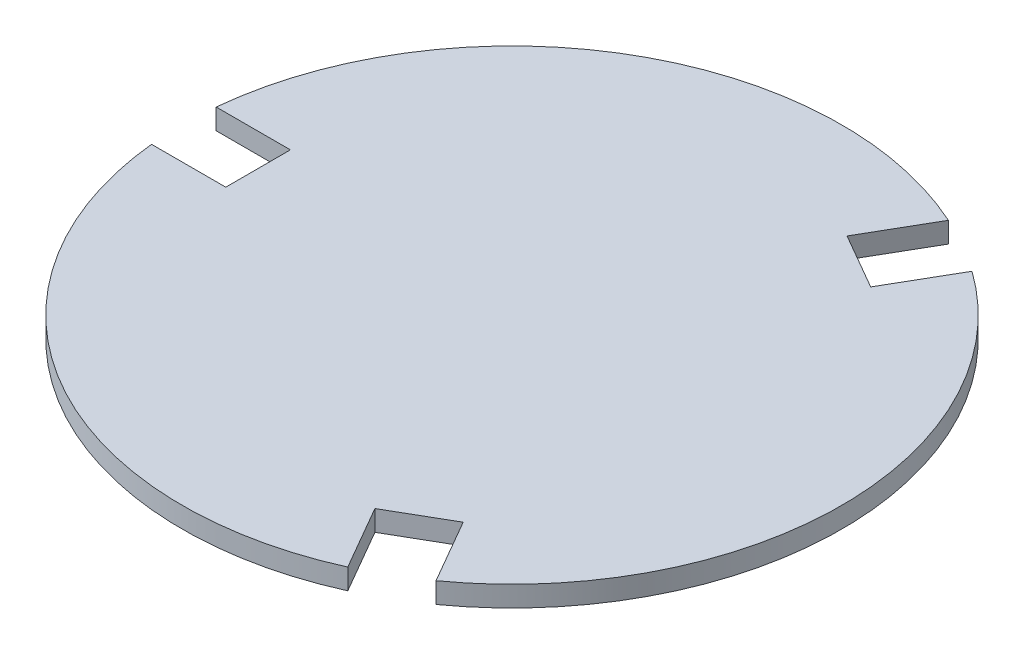
ISO-10303-21;
HEADER;
FILE_DESCRIPTION(('STEP AP214'),'2;1');
FILE_NAME('part.step','',(''),(''),'','','');
FILE_SCHEMA(('AUTOMOTIVE_DESIGN { 1 0 10303 214 1 1 1 1 }'));
ENDSEC;
DATA;
#1=APPLICATION_CONTEXT('core data for automotive mechanical design processes');
#2=APPLICATION_PROTOCOL_DEFINITION('international standard','automotive_design',2000,#1);
#3=PRODUCT_CONTEXT('',#1,'mechanical');
#4=PRODUCT('Part','Part','',(#3));
#5=PRODUCT_RELATED_PRODUCT_CATEGORY('part','',(#4));
#6=PRODUCT_DEFINITION_FORMATION('','',#4);
#7=PRODUCT_DEFINITION_CONTEXT('part definition',#1,'design');
#8=PRODUCT_DEFINITION('design','',#6,#7);
#9=PRODUCT_DEFINITION_SHAPE('','',#8);
#10=(LENGTH_UNIT() NAMED_UNIT(*) SI_UNIT(.MILLI.,.METRE.));
#11=(NAMED_UNIT(*) PLANE_ANGLE_UNIT() SI_UNIT($,.RADIAN.));
#12=(NAMED_UNIT(*) SI_UNIT($,.STERADIAN.) SOLID_ANGLE_UNIT());
#13=UNCERTAINTY_MEASURE_WITH_UNIT(LENGTH_MEASURE(1.E-05),#10,'distance_accuracy_value','');
#14=(GEOMETRIC_REPRESENTATION_CONTEXT(3) GLOBAL_UNCERTAINTY_ASSIGNED_CONTEXT((#13)) GLOBAL_UNIT_ASSIGNED_CONTEXT((#10,
#11,#12)) REPRESENTATION_CONTEXT('',''));
#15=CARTESIAN_POINT('',(0.,0.,0.));
#16=DIRECTION('',(0.,0.,1.));
#17=DIRECTION('',(1.,0.,0.));
#18=AXIS2_PLACEMENT_3D('',#15,#16,#17);
#19=CARTESIAN_POINT('',(0.,3.175,0.));
#20=DIRECTION('',(0.,-1.,0.));
#21=DIRECTION('',(0.,0.,-1.));
#22=AXIS2_PLACEMENT_3D('',#19,#20,#21);
#23=CYLINDRICAL_SURFACE('',#22,50.8);
#24=CARTESIAN_POINT('',(0.,0.,0.));
#25=DIRECTION('',(0.,1.,0.));
#26=DIRECTION('',(0.,0.,1.));
#27=AXIS2_PLACEMENT_3D('',#24,#25,#26);
#28=CIRCLE('',#27,50.8);
#29=CARTESIAN_POINT('',(-50.5554698666722,0.,4.9784));
#30=VERTEX_POINT('',#29);
#31=CARTESIAN_POINT('',(20.9663140631359,0.,46.2715212047967));
#32=VERTEX_POINT('',#31);
#33=EDGE_CURVE('E209',#30,#32,#28,.T.);
#34=ORIENTED_EDGE('',*,*,#33,.T.);
#35=DIRECTION('',(0.,-1.,0.));
#36=VECTOR('',#35,1.);
#37=CARTESIAN_POINT('',(20.9663140631359,3.175,46.2715212047967));
#38=LINE('',#37,#36);
#39=CARTESIAN_POINT('',(20.9663140631359,3.175,46.2715212047967));
#40=VERTEX_POINT('',#39);
#41=EDGE_CURVE('E130',#32,#40,#38,.F.);
#42=ORIENTED_EDGE('',*,*,#41,.T.);
#43=CARTESIAN_POINT('',(0.,3.175,0.));
#44=DIRECTION('',(0.,1.,0.));
#45=DIRECTION('',(0.,0.,1.));
#46=AXIS2_PLACEMENT_3D('',#43,#44,#45);
#47=CIRCLE('',#46,50.8);
#48=CARTESIAN_POINT('',(-50.5554698666722,3.175,4.9784));
#49=VERTEX_POINT('',#48);
#50=EDGE_CURVE('E203',#49,#40,#47,.T.);
#51=ORIENTED_EDGE('',*,*,#50,.F.);
#52=DIRECTION('',(0.,-1.,0.));
#53=VECTOR('',#52,1.);
#54=CARTESIAN_POINT('',(-50.5554698666722,3.175,4.9784));
#55=LINE('',#54,#53);
#56=EDGE_CURVE('E194',#49,#30,#55,.T.);
#57=ORIENTED_EDGE('',*,*,#56,.T.);
#58=EDGE_LOOP('',(#34,#42,#51,#57));
#59=FACE_BOUND('',#58,.T.);
#60=ADVANCED_FACE('F33',(#59),#23,.T.);
#61=CARTESIAN_POINT('',(29.5891558035367,3.175,41.2931212047967));
#62=VERTEX_POINT('',#61);
#63=CARTESIAN_POINT('',(29.5891558035367,3.175,-41.2931212047967));
#64=VERTEX_POINT('',#63);
#65=EDGE_CURVE('E207',#62,#64,#47,.T.);
#66=ORIENTED_EDGE('',*,*,#65,.F.);
#67=DIRECTION('',(0.,-1.,0.));
#68=VECTOR('',#67,1.);
#69=CARTESIAN_POINT('',(29.5891558035367,3.175,41.2931212047967));
#70=LINE('',#69,#68);
#71=CARTESIAN_POINT('',(29.5891558035367,0.,41.2931212047967));
#72=VERTEX_POINT('',#71);
#73=EDGE_CURVE('E140',#62,#72,#70,.T.);
#74=ORIENTED_EDGE('',*,*,#73,.T.);
#75=CARTESIAN_POINT('',(29.5891558035367,0.,-41.2931212047967));
#76=VERTEX_POINT('',#75);
#77=EDGE_CURVE('E211',#72,#76,#28,.T.);
#78=ORIENTED_EDGE('',*,*,#77,.T.);
#79=DIRECTION('',(0.,-1.,0.));
#80=VECTOR('',#79,1.);
#81=CARTESIAN_POINT('',(29.5891558035367,3.175,-41.2931212047967));
#82=LINE('',#81,#80);
#83=EDGE_CURVE('E174',#76,#64,#82,.F.);
#84=ORIENTED_EDGE('',*,*,#83,.T.);
#85=EDGE_LOOP('',(#66,#74,#78,#84));
#86=FACE_BOUND('',#85,.T.);
#87=ADVANCED_FACE('F232',(#86),#23,.T.);
#88=CARTESIAN_POINT('',(20.9663140631359,3.175,-46.2715212047967));
#89=VERTEX_POINT('',#88);
#90=CARTESIAN_POINT('',(-50.5554698666722,3.175,-4.9784));
#91=VERTEX_POINT('',#90);
#92=EDGE_CURVE('E208',#89,#91,#47,.T.);
#93=ORIENTED_EDGE('',*,*,#92,.F.);
#94=DIRECTION('',(0.,-1.,0.));
#95=VECTOR('',#94,1.);
#96=CARTESIAN_POINT('',(20.9663140631359,3.175,-46.2715212047967));
#97=LINE('',#96,#95);
#98=CARTESIAN_POINT('',(20.9663140631359,0.,-46.2715212047967));
#99=VERTEX_POINT('',#98);
#100=EDGE_CURVE('E170',#89,#99,#97,.T.);
#101=ORIENTED_EDGE('',*,*,#100,.T.);
#102=CARTESIAN_POINT('',(-50.5554698666722,0.,-4.9784));
#103=VERTEX_POINT('',#102);
#104=EDGE_CURVE('E202',#99,#103,#28,.T.);
#105=ORIENTED_EDGE('',*,*,#104,.T.);
#106=DIRECTION('',(0.,-1.,0.));
#107=VECTOR('',#106,1.);
#108=CARTESIAN_POINT('',(-50.5554698666722,3.175,-4.9784));
#109=LINE('',#108,#107);
#110=EDGE_CURVE('E199',#103,#91,#109,.F.);
#111=ORIENTED_EDGE('',*,*,#110,.T.);
#112=EDGE_LOOP('',(#93,#101,#105,#111));
#113=FACE_BOUND('',#112,.T.);
#114=ADVANCED_FACE('F35',(#113),#23,.T.);
#115=CARTESIAN_POINT('',(0.,3.175,0.));
#116=DIRECTION('',(0.,1.,0.));
#117=DIRECTION('',(0.,0.,1.));
#118=AXIS2_PLACEMENT_3D('',#115,#116,#117);
#119=PLANE('',#118);
#120=DIRECTION('',(0.500000000000004,0.,0.866025403784436));
#121=VECTOR('',#120,1.);
#122=CARTESIAN_POINT('',(20.9663140631359,3.175,46.2715212047967));
#123=LINE('',#122,#121);
#124=CARTESIAN_POINT('',(15.2513140631358,3.175,36.3728508395406));
#125=VERTEX_POINT('',#124);
#126=EDGE_CURVE('E134',#125,#40,#123,.T.);
#127=ORIENTED_EDGE('',*,*,#126,.F.);
#128=DIRECTION('',(-0.866025403784436,0.,0.500000000000004));
#129=VECTOR('',#128,1.);
#130=CARTESIAN_POINT('',(15.2513140631358,3.175,36.3728508395406));
#131=LINE('',#130,#129);
#132=CARTESIAN_POINT('',(23.8741558035367,3.175,31.3944508395406));
#133=VERTEX_POINT('',#132);
#134=EDGE_CURVE('E138',#133,#125,#131,.T.);
#135=ORIENTED_EDGE('',*,*,#134,.F.);
#136=DIRECTION('',(-0.500000000000004,0.,-0.866025403784436));
#137=VECTOR('',#136,1.);
#138=CARTESIAN_POINT('',(23.8741558035367,3.175,31.3944508395406));
#139=LINE('',#138,#137);
#140=EDGE_CURVE('E148',#62,#133,#139,.T.);
#141=ORIENTED_EDGE('',*,*,#140,.F.);
#142=ORIENTED_EDGE('',*,*,#65,.T.);
#143=DIRECTION('',(0.500000000000004,0.,-0.866025403784436));
#144=VECTOR('',#143,1.);
#145=CARTESIAN_POINT('',(29.5891558035367,3.175,-41.2931212047967));
#146=LINE('',#145,#144);
#147=CARTESIAN_POINT('',(23.8741558035367,3.175,-31.3944508395406));
#148=VERTEX_POINT('',#147);
#149=EDGE_CURVE('E159',#148,#64,#146,.T.);
#150=ORIENTED_EDGE('',*,*,#149,.F.);
#151=DIRECTION('',(0.866025403784436,0.,0.500000000000004));
#152=VECTOR('',#151,1.);
#153=CARTESIAN_POINT('',(23.8741558035367,3.175,-31.3944508395406));
#154=LINE('',#153,#152);
#155=CARTESIAN_POINT('',(15.2513140631358,3.175,-36.3728508395406));
#156=VERTEX_POINT('',#155);
#157=EDGE_CURVE('E163',#156,#148,#154,.T.);
#158=ORIENTED_EDGE('',*,*,#157,.F.);
#159=DIRECTION('',(-0.500000000000004,0.,0.866025403784436));
#160=VECTOR('',#159,1.);
#161=CARTESIAN_POINT('',(15.2513140631358,3.175,-36.3728508395406));
#162=LINE('',#161,#160);
#163=EDGE_CURVE('E155',#89,#156,#162,.T.);
#164=ORIENTED_EDGE('',*,*,#163,.F.);
#165=ORIENTED_EDGE('',*,*,#92,.T.);
#166=DIRECTION('',(-1.,0.,0.));
#167=VECTOR('',#166,1.);
#168=CARTESIAN_POINT('',(-50.5554698666722,3.175,-4.9784));
#169=LINE('',#168,#167);
#170=CARTESIAN_POINT('',(-39.1254698666722,3.175,-4.9784));
#171=VERTEX_POINT('',#170);
#172=EDGE_CURVE('E182',#171,#91,#169,.T.);
#173=ORIENTED_EDGE('',*,*,#172,.F.);
#174=DIRECTION('',(0.,0.,-1.));
#175=VECTOR('',#174,1.);
#176=CARTESIAN_POINT('',(-39.1254698666722,3.175,-4.9784));
#177=LINE('',#176,#175);
#178=CARTESIAN_POINT('',(-39.1254698666722,3.175,4.9784));
#179=VERTEX_POINT('',#178);
#180=EDGE_CURVE('E187',#179,#171,#177,.T.);
#181=ORIENTED_EDGE('',*,*,#180,.F.);
#182=DIRECTION('',(1.,0.,0.));
#183=VECTOR('',#182,1.);
#184=CARTESIAN_POINT('',(-39.1254698666722,3.175,4.9784));
#185=LINE('',#184,#183);
#186=EDGE_CURVE('E177',#49,#179,#185,.T.);
#187=ORIENTED_EDGE('',*,*,#186,.F.);
#188=ORIENTED_EDGE('',*,*,#50,.T.);
#189=EDGE_LOOP('',(#127,#135,#141,#142,#150,#158,#164,#165,#173,#181,#187,#188));
#190=FACE_BOUND('',#189,.T.);
#191=ADVANCED_FACE('F226',(#190),#119,.T.);
#192=CARTESIAN_POINT('',(0.,0.,0.));
#193=DIRECTION('',(0.,1.,0.));
#194=DIRECTION('',(0.,0.,1.));
#195=AXIS2_PLACEMENT_3D('',#192,#193,#194);
#196=PLANE('',#195);
#197=DIRECTION('',(-0.866025403784436,0.,0.500000000000004));
#198=VECTOR('',#197,1.);
#199=CARTESIAN_POINT('',(15.2513140631358,0.,36.3728508395406));
#200=LINE('',#199,#198);
#201=CARTESIAN_POINT('',(23.8741558035367,0.,31.3944508395406));
#202=VERTEX_POINT('',#201);
#203=CARTESIAN_POINT('',(15.2513140631358,0.,36.3728508395406));
#204=VERTEX_POINT('',#203);
#205=EDGE_CURVE('E48',#202,#204,#200,.T.);
#206=ORIENTED_EDGE('',*,*,#205,.T.);
#207=DIRECTION('',(0.500000000000004,0.,0.866025403784436));
#208=VECTOR('',#207,1.);
#209=CARTESIAN_POINT('',(20.9663140631359,0.,46.2715212047967));
#210=LINE('',#209,#208);
#211=EDGE_CURVE('E125',#204,#32,#210,.T.);
#212=ORIENTED_EDGE('',*,*,#211,.T.);
#213=ORIENTED_EDGE('',*,*,#33,.F.);
#214=DIRECTION('',(1.,0.,0.));
#215=VECTOR('',#214,1.);
#216=CARTESIAN_POINT('',(0.,0.,4.9784));
#217=LINE('',#216,#215);
#218=CARTESIAN_POINT('',(-39.1254698666722,0.,4.9784));
#219=VERTEX_POINT('',#218);
#220=EDGE_CURVE('E206',#30,#219,#217,.T.);
#221=ORIENTED_EDGE('',*,*,#220,.T.);
#222=DIRECTION('',(0.,0.,-1.));
#223=VECTOR('',#222,1.);
#224=CARTESIAN_POINT('',(-39.1254698666722,0.,-4.9784));
#225=LINE('',#224,#223);
#226=CARTESIAN_POINT('',(-39.1254698666722,0.,-4.9784));
#227=VERTEX_POINT('',#226);
#228=EDGE_CURVE('E181',#219,#227,#225,.T.);
#229=ORIENTED_EDGE('',*,*,#228,.T.);
#230=DIRECTION('',(-1.,0.,0.));
#231=VECTOR('',#230,1.);
#232=CARTESIAN_POINT('',(-50.5554698666722,0.,-4.9784));
#233=LINE('',#232,#231);
#234=EDGE_CURVE('E178',#227,#103,#233,.T.);
#235=ORIENTED_EDGE('',*,*,#234,.T.);
#236=ORIENTED_EDGE('',*,*,#104,.F.);
#237=DIRECTION('',(-0.500000000000004,0.,0.866025403784436));
#238=VECTOR('',#237,1.);
#239=CARTESIAN_POINT('',(-4.31142087020044,0.,-2.48920000000002));
#240=LINE('',#239,#238);
#241=CARTESIAN_POINT('',(15.2513140631358,0.,-36.3728508395406));
#242=VERTEX_POINT('',#241);
#243=EDGE_CURVE('E41',#99,#242,#240,.T.);
#244=ORIENTED_EDGE('',*,*,#243,.T.);
#245=DIRECTION('',(0.866025403784436,0.,0.500000000000004));
#246=VECTOR('',#245,1.);
#247=CARTESIAN_POINT('',(23.8741558035367,0.,-31.3944508395406));
#248=LINE('',#247,#246);
#249=CARTESIAN_POINT('',(23.8741558035367,0.,-31.3944508395406));
#250=VERTEX_POINT('',#249);
#251=EDGE_CURVE('E56',#242,#250,#248,.T.);
#252=ORIENTED_EDGE('',*,*,#251,.T.);
#253=DIRECTION('',(0.500000000000004,0.,-0.866025403784436));
#254=VECTOR('',#253,1.);
#255=CARTESIAN_POINT('',(29.5891558035367,0.,-41.2931212047967));
#256=LINE('',#255,#254);
#257=EDGE_CURVE('E156',#250,#76,#256,.T.);
#258=ORIENTED_EDGE('',*,*,#257,.T.);
#259=ORIENTED_EDGE('',*,*,#77,.F.);
#260=DIRECTION('',(-0.500000000000004,0.,-0.866025403784436));
#261=VECTOR('',#260,1.);
#262=CARTESIAN_POINT('',(4.31142087020044,0.,-2.48920000000002));
#263=LINE('',#262,#261);
#264=EDGE_CURVE('E11',#72,#202,#263,.T.);
#265=ORIENTED_EDGE('',*,*,#264,.T.);
#266=EDGE_LOOP('',(#206,#212,#213,#221,#229,#235,#236,#244,#252,#258,#259,#265));
#267=FACE_BOUND('',#266,.T.);
#268=ADVANCED_FACE('F143',(#267),#196,.F.);
#269=CARTESIAN_POINT('',(-50.5554698666722,0.,-4.9784));
#270=DIRECTION('',(0.,0.,-1.));
#271=DIRECTION('',(-1.,0.,0.));
#272=AXIS2_PLACEMENT_3D('',#269,#270,#271);
#273=PLANE('',#272);
#274=ORIENTED_EDGE('',*,*,#234,.F.);
#275=DIRECTION('',(0.,1.,0.));
#276=VECTOR('',#275,1.);
#277=CARTESIAN_POINT('',(-39.1254698666722,0.,-4.9784));
#278=LINE('',#277,#276);
#279=EDGE_CURVE('E192',#227,#171,#278,.T.);
#280=ORIENTED_EDGE('',*,*,#279,.T.);
#281=ORIENTED_EDGE('',*,*,#172,.T.);
#282=ORIENTED_EDGE('',*,*,#110,.F.);
#283=EDGE_LOOP('',(#274,#280,#281,#282));
#284=FACE_BOUND('',#283,.T.);
#285=ADVANCED_FACE('F257',(#284),#273,.F.);
#286=CARTESIAN_POINT('',(-39.1254698666722,0.,4.9784));
#287=DIRECTION('',(0.,0.,1.));
#288=DIRECTION('',(1.,0.,0.));
#289=AXIS2_PLACEMENT_3D('',#286,#287,#288);
#290=PLANE('',#289);
#291=ORIENTED_EDGE('',*,*,#186,.T.);
#292=DIRECTION('',(0.,1.,0.));
#293=VECTOR('',#292,1.);
#294=CARTESIAN_POINT('',(-39.1254698666722,0.,4.9784));
#295=LINE('',#294,#293);
#296=EDGE_CURVE('E185',#219,#179,#295,.T.);
#297=ORIENTED_EDGE('',*,*,#296,.F.);
#298=ORIENTED_EDGE('',*,*,#220,.F.);
#299=ORIENTED_EDGE('',*,*,#56,.F.);
#300=EDGE_LOOP('',(#291,#297,#298,#299));
#301=FACE_BOUND('',#300,.T.);
#302=ADVANCED_FACE('F259',(#301),#290,.F.);
#303=CARTESIAN_POINT('',(-39.1254698666722,0.,-4.9784));
#304=DIRECTION('',(1.,0.,0.));
#305=DIRECTION('',(0.,0.,-1.));
#306=AXIS2_PLACEMENT_3D('',#303,#304,#305);
#307=PLANE('',#306);
#308=ORIENTED_EDGE('',*,*,#180,.T.);
#309=ORIENTED_EDGE('',*,*,#279,.F.);
#310=ORIENTED_EDGE('',*,*,#228,.F.);
#311=ORIENTED_EDGE('',*,*,#296,.T.);
#312=EDGE_LOOP('',(#308,#309,#310,#311));
#313=FACE_BOUND('',#312,.T.);
#314=ADVANCED_FACE('F262',(#313),#307,.F.);
#315=CARTESIAN_POINT('',(29.5891558035367,0.,-41.2931212047967));
#316=DIRECTION('',(0.866025403784436,0.,0.500000000000004));
#317=DIRECTION('',(0.500000000000004,0.,-0.866025403784436));
#318=AXIS2_PLACEMENT_3D('',#315,#316,#317);
#319=PLANE('',#318);
#320=ORIENTED_EDGE('',*,*,#257,.F.);
#321=DIRECTION('',(0.,1.,0.));
#322=VECTOR('',#321,1.);
#323=CARTESIAN_POINT('',(23.8741558035367,0.,-31.3944508395406));
#324=LINE('',#323,#322);
#325=EDGE_CURVE('E168',#250,#148,#324,.T.);
#326=ORIENTED_EDGE('',*,*,#325,.T.);
#327=ORIENTED_EDGE('',*,*,#149,.T.);
#328=ORIENTED_EDGE('',*,*,#83,.F.);
#329=EDGE_LOOP('',(#320,#326,#327,#328));
#330=FACE_BOUND('',#329,.T.);
#331=ADVANCED_FACE('F231',(#330),#319,.F.);
#332=CARTESIAN_POINT('',(15.2513140631358,0.,-36.3728508395406));
#333=DIRECTION('',(-0.866025403784436,0.,-0.500000000000004));
#334=DIRECTION('',(-0.500000000000004,0.,0.866025403784436));
#335=AXIS2_PLACEMENT_3D('',#332,#333,#334);
#336=PLANE('',#335);
#337=ORIENTED_EDGE('',*,*,#163,.T.);
#338=DIRECTION('',(0.,1.,0.));
#339=VECTOR('',#338,1.);
#340=CARTESIAN_POINT('',(15.2513140631358,0.,-36.3728508395406));
#341=LINE('',#340,#339);
#342=EDGE_CURVE('E161',#242,#156,#341,.T.);
#343=ORIENTED_EDGE('',*,*,#342,.F.);
#344=ORIENTED_EDGE('',*,*,#243,.F.);
#345=ORIENTED_EDGE('',*,*,#100,.F.);
#346=EDGE_LOOP('',(#337,#343,#344,#345));
#347=FACE_BOUND('',#346,.T.);
#348=ADVANCED_FACE('F216',(#347),#336,.F.);
#349=CARTESIAN_POINT('',(23.8741558035367,0.,-31.3944508395406));
#350=DIRECTION('',(-0.500000000000004,0.,0.866025403784436));
#351=DIRECTION('',(0.866025403784436,0.,0.500000000000004));
#352=AXIS2_PLACEMENT_3D('',#349,#350,#351);
#353=PLANE('',#352);
#354=ORIENTED_EDGE('',*,*,#157,.T.);
#355=ORIENTED_EDGE('',*,*,#325,.F.);
#356=ORIENTED_EDGE('',*,*,#251,.F.);
#357=ORIENTED_EDGE('',*,*,#342,.T.);
#358=EDGE_LOOP('',(#354,#355,#356,#357));
#359=FACE_BOUND('',#358,.T.);
#360=ADVANCED_FACE('F233',(#359),#353,.F.);
#361=CARTESIAN_POINT('',(20.9663140631359,0.,46.2715212047967));
#362=DIRECTION('',(-0.866025403784436,0.,0.500000000000004));
#363=DIRECTION('',(0.500000000000004,0.,0.866025403784436));
#364=AXIS2_PLACEMENT_3D('',#361,#362,#363);
#365=PLANE('',#364);
#366=ORIENTED_EDGE('',*,*,#211,.F.);
#367=DIRECTION('',(0.,1.,0.));
#368=VECTOR('',#367,1.);
#369=CARTESIAN_POINT('',(15.2513140631358,0.,36.3728508395406));
#370=LINE('',#369,#368);
#371=EDGE_CURVE('E127',#204,#125,#370,.T.);
#372=ORIENTED_EDGE('',*,*,#371,.T.);
#373=ORIENTED_EDGE('',*,*,#126,.T.);
#374=ORIENTED_EDGE('',*,*,#41,.F.);
#375=EDGE_LOOP('',(#366,#372,#373,#374));
#376=FACE_BOUND('',#375,.T.);
#377=ADVANCED_FACE('F126',(#376),#365,.F.);
#378=CARTESIAN_POINT('',(23.8741558035367,0.,31.3944508395406));
#379=DIRECTION('',(0.866025403784436,0.,-0.500000000000004));
#380=DIRECTION('',(-0.500000000000004,0.,-0.866025403784436));
#381=AXIS2_PLACEMENT_3D('',#378,#379,#380);
#382=PLANE('',#381);
#383=ORIENTED_EDGE('',*,*,#140,.T.);
#384=DIRECTION('',(0.,1.,0.));
#385=VECTOR('',#384,1.);
#386=CARTESIAN_POINT('',(23.8741558035367,0.,31.3944508395406));
#387=LINE('',#386,#385);
#388=EDGE_CURVE('E141',#202,#133,#387,.T.);
#389=ORIENTED_EDGE('',*,*,#388,.F.);
#390=ORIENTED_EDGE('',*,*,#264,.F.);
#391=ORIENTED_EDGE('',*,*,#73,.F.);
#392=EDGE_LOOP('',(#383,#389,#390,#391));
#393=FACE_BOUND('',#392,.T.);
#394=ADVANCED_FACE('F240',(#393),#382,.F.);
#395=CARTESIAN_POINT('',(15.2513140631358,0.,36.3728508395406));
#396=DIRECTION('',(-0.500000000000004,0.,-0.866025403784436));
#397=DIRECTION('',(-0.866025403784436,0.,0.500000000000004));
#398=AXIS2_PLACEMENT_3D('',#395,#396,#397);
#399=PLANE('',#398);
#400=ORIENTED_EDGE('',*,*,#134,.T.);
#401=ORIENTED_EDGE('',*,*,#371,.F.);
#402=ORIENTED_EDGE('',*,*,#205,.F.);
#403=ORIENTED_EDGE('',*,*,#388,.T.);
#404=EDGE_LOOP('',(#400,#401,#402,#403));
#405=FACE_BOUND('',#404,.T.);
#406=ADVANCED_FACE('F136',(#405),#399,.F.);
#407=CLOSED_SHELL('',(#60,#87,#114,#191,#268,#285,#302,#314,#331,#348,#360,#377,#394,#406));
#408=MANIFOLD_SOLID_BREP('B2',#407);
#409=ADVANCED_BREP_SHAPE_REPRESENTATION('',(#18,#408),#14);
#410=SHAPE_DEFINITION_REPRESENTATION(#9,#409);
ENDSEC;
END-ISO-10303-21;
